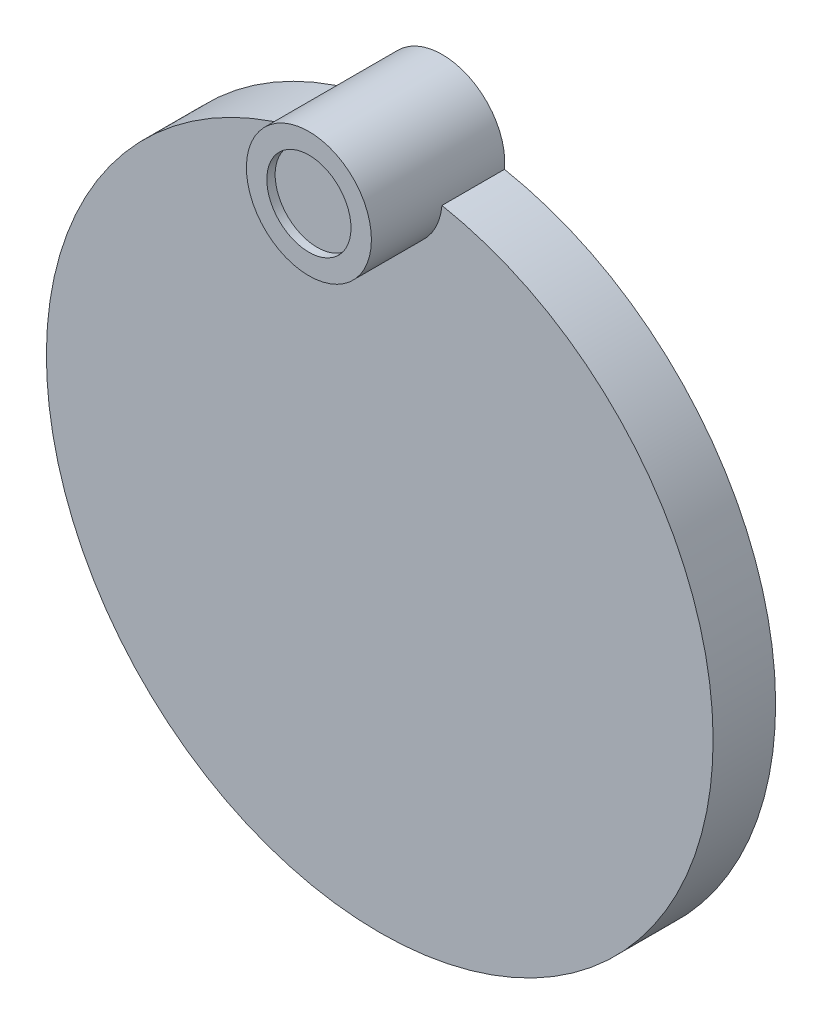
ISO-10303-21;
HEADER;
FILE_DESCRIPTION(('STEP AP214'),'2;1');
FILE_NAME('part.step','',(''),(''),'','','');
FILE_SCHEMA(('AUTOMOTIVE_DESIGN { 1 0 10303 214 1 1 1 1 }'));
ENDSEC;
DATA;
#1=APPLICATION_CONTEXT('core data for automotive mechanical design processes');
#2=APPLICATION_PROTOCOL_DEFINITION('international standard','automotive_design',2000,#1);
#3=PRODUCT_CONTEXT('',#1,'mechanical');
#4=PRODUCT('Part','Part','',(#3));
#5=PRODUCT_RELATED_PRODUCT_CATEGORY('part','',(#4));
#6=PRODUCT_DEFINITION_FORMATION('','',#4);
#7=PRODUCT_DEFINITION_CONTEXT('part definition',#1,'design');
#8=PRODUCT_DEFINITION('design','',#6,#7);
#9=PRODUCT_DEFINITION_SHAPE('','',#8);
#10=(LENGTH_UNIT() NAMED_UNIT(*) SI_UNIT(.MILLI.,.METRE.));
#11=(NAMED_UNIT(*) PLANE_ANGLE_UNIT() SI_UNIT($,.RADIAN.));
#12=(NAMED_UNIT(*) SI_UNIT($,.STERADIAN.) SOLID_ANGLE_UNIT());
#13=UNCERTAINTY_MEASURE_WITH_UNIT(LENGTH_MEASURE(1.E-05),#10,'distance_accuracy_value','');
#14=(GEOMETRIC_REPRESENTATION_CONTEXT(3) GLOBAL_UNCERTAINTY_ASSIGNED_CONTEXT((#13)) GLOBAL_UNIT_ASSIGNED_CONTEXT((#10,
#11,#12)) REPRESENTATION_CONTEXT('',''));
#15=CARTESIAN_POINT('',(0.,0.,0.));
#16=DIRECTION('',(0.,0.,1.));
#17=DIRECTION('',(1.,0.,0.));
#18=AXIS2_PLACEMENT_3D('',#15,#16,#17);
#19=CARTESIAN_POINT('',(0.,-80.,15.));
#20=DIRECTION('',(0.,0.,-1.));
#21=DIRECTION('',(-1.,0.,0.));
#22=AXIS2_PLACEMENT_3D('',#19,#20,#21);
#23=CYLINDRICAL_SURFACE('',#22,80.);
#24=CARTESIAN_POINT('',(0.,-80.,0.));
#25=DIRECTION('',(0.,0.,1.));
#26=DIRECTION('',(1.,0.,0.));
#27=AXIS2_PLACEMENT_3D('',#24,#25,#26);
#28=CIRCLE('',#27,80.);
#29=CARTESIAN_POINT('',(-14.9339365519444,-1.40625,0.));
#30=VERTEX_POINT('',#29);
#31=CARTESIAN_POINT('',(14.9339365519444,-1.40625000000001,0.));
#32=VERTEX_POINT('',#31);
#33=EDGE_CURVE('E74',#30,#32,#28,.T.);
#34=ORIENTED_EDGE('',*,*,#33,.T.);
#35=DIRECTION('',(0.,0.,-1.));
#36=VECTOR('',#35,1.);
#37=CARTESIAN_POINT('',(14.9339365519444,-1.40625000000001,15.));
#38=LINE('',#37,#36);
#39=CARTESIAN_POINT('',(14.9339365519444,-1.40625000000001,15.));
#40=VERTEX_POINT('',#39);
#41=EDGE_CURVE('E11',#40,#32,#38,.T.);
#42=ORIENTED_EDGE('',*,*,#41,.F.);
#43=CARTESIAN_POINT('',(0.,-80.,15.));
#44=DIRECTION('',(0.,0.,1.));
#45=DIRECTION('',(1.,0.,0.));
#46=AXIS2_PLACEMENT_3D('',#43,#44,#45);
#47=CIRCLE('',#46,80.);
#48=CARTESIAN_POINT('',(-14.9339365519444,-1.40625000000001,15.));
#49=VERTEX_POINT('',#48);
#50=EDGE_CURVE('E48',#49,#40,#47,.T.);
#51=ORIENTED_EDGE('',*,*,#50,.F.);
#52=DIRECTION('',(0.,0.,-1.));
#53=VECTOR('',#52,1.);
#54=CARTESIAN_POINT('',(-14.9339365519444,-1.40625,15.));
#55=LINE('',#54,#53);
#56=EDGE_CURVE('E42',#49,#30,#55,.T.);
#57=ORIENTED_EDGE('',*,*,#56,.T.);
#58=EDGE_LOOP('',(#34,#42,#51,#57));
#59=FACE_BOUND('',#58,.T.);
#60=ADVANCED_FACE('F33',(#59),#23,.T.);
#61=CARTESIAN_POINT('',(0.,0.,15.));
#62=DIRECTION('',(0.,0.,-1.));
#63=DIRECTION('',(-1.,0.,0.));
#64=AXIS2_PLACEMENT_3D('',#61,#62,#63);
#65=CYLINDRICAL_SURFACE('',#64,15.);
#66=CARTESIAN_POINT('',(0.,0.,0.));
#67=DIRECTION('',(0.,0.,1.));
#68=DIRECTION('',(1.,0.,0.));
#69=AXIS2_PLACEMENT_3D('',#66,#67,#68);
#70=CIRCLE('',#69,15.);
#71=EDGE_CURVE('E57',#32,#30,#70,.T.);
#72=ORIENTED_EDGE('',*,*,#71,.T.);
#73=ORIENTED_EDGE('',*,*,#56,.F.);
#74=CARTESIAN_POINT('',(0.,0.,15.));
#75=DIRECTION('',(0.,0.,1.));
#76=DIRECTION('',(1.,0.,0.));
#77=AXIS2_PLACEMENT_3D('',#74,#75,#76);
#78=CIRCLE('',#77,15.);
#79=EDGE_CURVE('E67',#49,#40,#78,.T.);
#80=ORIENTED_EDGE('',*,*,#79,.T.);
#81=ORIENTED_EDGE('',*,*,#41,.T.);
#82=EDGE_LOOP('',(#72,#73,#80,#81));
#83=FACE_BOUND('',#82,.T.);
#84=CARTESIAN_POINT('',(0.,0.,32.));
#85=DIRECTION('',(0.,0.,1.));
#86=DIRECTION('',(1.,0.,0.));
#87=AXIS2_PLACEMENT_3D('',#84,#85,#86);
#88=CIRCLE('',#87,15.);
#89=CARTESIAN_POINT('',(15.,0.,32.));
#90=VERTEX_POINT('',#89);
#91=EDGE_CURVE('E70',#90,#90,#88,.T.);
#92=ORIENTED_EDGE('',*,*,#91,.F.);
#93=EDGE_LOOP('',(#92));
#94=FACE_BOUND('',#93,.T.);
#95=ADVANCED_FACE('F65',(#83,#94),#65,.T.);
#96=CARTESIAN_POINT('',(0.,0.,15.));
#97=DIRECTION('',(0.,0.,1.));
#98=DIRECTION('',(1.,0.,0.));
#99=AXIS2_PLACEMENT_3D('',#96,#97,#98);
#100=PLANE('',#99);
#101=ORIENTED_EDGE('',*,*,#79,.F.);
#102=ORIENTED_EDGE('',*,*,#50,.T.);
#103=EDGE_LOOP('',(#101,#102));
#104=FACE_BOUND('',#103,.T.);
#105=ADVANCED_FACE('F69',(#104),#100,.T.);
#106=CARTESIAN_POINT('',(0.,0.,0.));
#107=DIRECTION('',(0.,0.,1.));
#108=DIRECTION('',(1.,0.,0.));
#109=AXIS2_PLACEMENT_3D('',#106,#107,#108);
#110=PLANE('',#109);
#111=ORIENTED_EDGE('',*,*,#33,.F.);
#112=ORIENTED_EDGE('',*,*,#71,.F.);
#113=EDGE_LOOP('',(#111,#112));
#114=FACE_BOUND('',#113,.T.);
#115=ADVANCED_FACE('F88',(#114),#110,.F.);
#116=CARTESIAN_POINT('',(0.,0.,32.));
#117=DIRECTION('',(0.,0.,1.));
#118=DIRECTION('',(1.,0.,0.));
#119=AXIS2_PLACEMENT_3D('',#116,#117,#118);
#120=PLANE('',#119);
#121=CARTESIAN_POINT('',(0.,0.,32.));
#122=DIRECTION('',(0.,0.,1.));
#123=DIRECTION('',(1.,0.,0.));
#124=AXIS2_PLACEMENT_3D('',#121,#122,#123);
#125=CIRCLE('',#124,10.1);
#126=CARTESIAN_POINT('',(10.1,0.,32.));
#127=VERTEX_POINT('',#126);
#128=EDGE_CURVE('E77',#127,#127,#125,.T.);
#129=ORIENTED_EDGE('',*,*,#128,.F.);
#130=EDGE_LOOP('',(#129));
#131=FACE_BOUND('',#130,.T.);
#132=ORIENTED_EDGE('',*,*,#91,.T.);
#133=EDGE_LOOP('',(#132));
#134=FACE_BOUND('',#133,.T.);
#135=ADVANCED_FACE('F90',(#131,#134),#120,.T.);
#136=CARTESIAN_POINT('',(0.,0.,30.));
#137=DIRECTION('',(0.,0.,1.));
#138=DIRECTION('',(1.,0.,0.));
#139=AXIS2_PLACEMENT_3D('',#136,#137,#138);
#140=CYLINDRICAL_SURFACE('',#139,10.1);
#141=CARTESIAN_POINT('',(0.,0.,30.));
#142=DIRECTION('',(0.,0.,1.));
#143=DIRECTION('',(1.,0.,0.));
#144=AXIS2_PLACEMENT_3D('',#141,#142,#143);
#145=CIRCLE('',#144,10.1);
#146=CARTESIAN_POINT('',(10.1,0.,30.));
#147=VERTEX_POINT('',#146);
#148=EDGE_CURVE('E71',#147,#147,#145,.T.);
#149=ORIENTED_EDGE('',*,*,#148,.F.);
#150=EDGE_LOOP('',(#149));
#151=FACE_BOUND('',#150,.T.);
#152=ORIENTED_EDGE('',*,*,#128,.T.);
#153=EDGE_LOOP('',(#152));
#154=FACE_BOUND('',#153,.T.);
#155=ADVANCED_FACE('F97',(#151,#154),#140,.F.);
#156=CARTESIAN_POINT('',(0.,0.,30.));
#157=DIRECTION('',(0.,0.,1.));
#158=DIRECTION('',(1.,0.,0.));
#159=AXIS2_PLACEMENT_3D('',#156,#157,#158);
#160=PLANE('',#159);
#161=ORIENTED_EDGE('',*,*,#148,.T.);
#162=EDGE_LOOP('',(#161));
#163=FACE_BOUND('',#162,.T.);
#164=ADVANCED_FACE('F117',(#163),#160,.T.);
#165=CLOSED_SHELL('',(#60,#95,#105,#115,#135,#155,#164));
#166=MANIFOLD_SOLID_BREP('B2',#165);
#167=ADVANCED_BREP_SHAPE_REPRESENTATION('',(#18,#166),#14);
#168=SHAPE_DEFINITION_REPRESENTATION(#9,#167);
ENDSEC;
END-ISO-10303-21;
